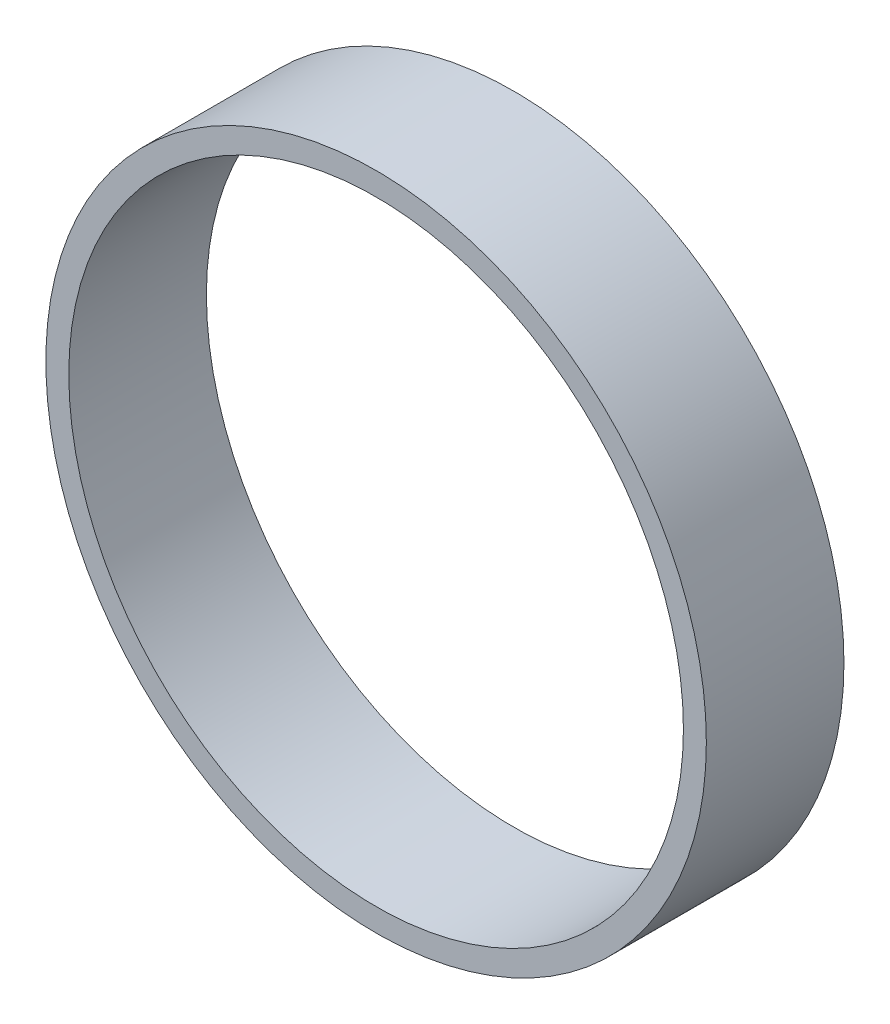
ISO-10303-21;
HEADER;
FILE_DESCRIPTION(('STEP AP214'),'2;1');
FILE_NAME('part.step','',(''),(''),'','','');
FILE_SCHEMA(('AUTOMOTIVE_DESIGN { 1 0 10303 214 1 1 1 1 }'));
ENDSEC;
DATA;
#1=APPLICATION_CONTEXT('core data for automotive mechanical design processes');
#2=APPLICATION_PROTOCOL_DEFINITION('international standard','automotive_design',2000,#1);
#3=PRODUCT_CONTEXT('',#1,'mechanical');
#4=PRODUCT('Part','Part','',(#3));
#5=PRODUCT_RELATED_PRODUCT_CATEGORY('part','',(#4));
#6=PRODUCT_DEFINITION_FORMATION('','',#4);
#7=PRODUCT_DEFINITION_CONTEXT('part definition',#1,'design');
#8=PRODUCT_DEFINITION('design','',#6,#7);
#9=PRODUCT_DEFINITION_SHAPE('','',#8);
#10=(LENGTH_UNIT() NAMED_UNIT(*) SI_UNIT(.MILLI.,.METRE.));
#11=(NAMED_UNIT(*) PLANE_ANGLE_UNIT() SI_UNIT($,.RADIAN.));
#12=(NAMED_UNIT(*) SI_UNIT($,.STERADIAN.) SOLID_ANGLE_UNIT());
#13=UNCERTAINTY_MEASURE_WITH_UNIT(LENGTH_MEASURE(1.E-05),#10,'distance_accuracy_value','');
#14=(GEOMETRIC_REPRESENTATION_CONTEXT(3) GLOBAL_UNCERTAINTY_ASSIGNED_CONTEXT((#13)) GLOBAL_UNIT_ASSIGNED_CONTEXT((#10,
#11,#12)) REPRESENTATION_CONTEXT('',''));
#15=CARTESIAN_POINT('',(0.,0.,0.));
#16=DIRECTION('',(0.,0.,1.));
#17=DIRECTION('',(1.,0.,0.));
#18=AXIS2_PLACEMENT_3D('',#15,#16,#17);
#19=CARTESIAN_POINT('',(0.,0.,30.));
#20=DIRECTION('',(0.,0.,1.));
#21=DIRECTION('',(1.,0.,0.));
#22=AXIS2_PLACEMENT_3D('',#19,#20,#21);
#23=PLANE('',#22);
#24=CARTESIAN_POINT('',(0.,0.,30.));
#25=DIRECTION('',(0.,0.,1.));
#26=DIRECTION('',(1.,0.,0.));
#27=AXIS2_PLACEMENT_3D('',#24,#25,#26);
#28=CIRCLE('',#27,72.);
#29=CARTESIAN_POINT('',(72.,0.,30.));
#30=VERTEX_POINT('',#29);
#31=EDGE_CURVE('E10',#30,#30,#28,.T.);
#32=ORIENTED_EDGE('',*,*,#31,.T.);
#33=EDGE_LOOP('',(#32));
#34=FACE_BOUND('',#33,.T.);
#35=CARTESIAN_POINT('',(0.,0.,30.));
#36=DIRECTION('',(0.,0.,1.));
#37=DIRECTION('',(1.,0.,0.));
#38=AXIS2_PLACEMENT_3D('',#35,#36,#37);
#39=CIRCLE('',#38,67.);
#40=CARTESIAN_POINT('',(67.,0.,30.));
#41=VERTEX_POINT('',#40);
#42=EDGE_CURVE('E52',#41,#41,#39,.T.);
#43=ORIENTED_EDGE('',*,*,#42,.F.);
#44=EDGE_LOOP('',(#43));
#45=FACE_BOUND('',#44,.T.);
#46=ADVANCED_FACE('F37',(#34,#45),#23,.T.);
#47=CARTESIAN_POINT('',(0.,0.,0.));
#48=DIRECTION('',(0.,0.,1.));
#49=DIRECTION('',(1.,0.,0.));
#50=AXIS2_PLACEMENT_3D('',#47,#48,#49);
#51=PLANE('',#50);
#52=CARTESIAN_POINT('',(0.,0.,0.));
#53=DIRECTION('',(0.,0.,1.));
#54=DIRECTION('',(1.,0.,0.));
#55=AXIS2_PLACEMENT_3D('',#52,#53,#54);
#56=CIRCLE('',#55,72.);
#57=CARTESIAN_POINT('',(72.,0.,0.));
#58=VERTEX_POINT('',#57);
#59=EDGE_CURVE('E41',#58,#58,#56,.T.);
#60=ORIENTED_EDGE('',*,*,#59,.F.);
#61=EDGE_LOOP('',(#60));
#62=FACE_BOUND('',#61,.T.);
#63=CARTESIAN_POINT('',(0.,0.,0.));
#64=DIRECTION('',(0.,0.,1.));
#65=DIRECTION('',(1.,0.,0.));
#66=AXIS2_PLACEMENT_3D('',#63,#64,#65);
#67=CIRCLE('',#66,67.);
#68=CARTESIAN_POINT('',(67.,0.,0.));
#69=VERTEX_POINT('',#68);
#70=EDGE_CURVE('E54',#69,#69,#67,.T.);
#71=ORIENTED_EDGE('',*,*,#70,.T.);
#72=EDGE_LOOP('',(#71));
#73=FACE_BOUND('',#72,.T.);
#74=ADVANCED_FACE('F64',(#62,#73),#51,.F.);
#75=CARTESIAN_POINT('',(0.,0.,30.));
#76=DIRECTION('',(0.,0.,-1.));
#77=DIRECTION('',(-1.,0.,0.));
#78=AXIS2_PLACEMENT_3D('',#75,#76,#77);
#79=CYLINDRICAL_SURFACE('',#78,72.);
#80=ORIENTED_EDGE('',*,*,#31,.F.);
#81=EDGE_LOOP('',(#80));
#82=FACE_BOUND('',#81,.T.);
#83=ORIENTED_EDGE('',*,*,#59,.T.);
#84=EDGE_LOOP('',(#83));
#85=FACE_BOUND('',#84,.T.);
#86=ADVANCED_FACE('F39',(#82,#85),#79,.T.);
#87=CARTESIAN_POINT('',(0.,0.,30.));
#88=DIRECTION('',(0.,0.,-1.));
#89=DIRECTION('',(-1.,0.,0.));
#90=AXIS2_PLACEMENT_3D('',#87,#88,#89);
#91=CYLINDRICAL_SURFACE('',#90,67.);
#92=ORIENTED_EDGE('',*,*,#42,.T.);
#93=EDGE_LOOP('',(#92));
#94=FACE_BOUND('',#93,.T.);
#95=ORIENTED_EDGE('',*,*,#70,.F.);
#96=EDGE_LOOP('',(#95));
#97=FACE_BOUND('',#96,.T.);
#98=ADVANCED_FACE('F60',(#94,#97),#91,.F.);
#99=CLOSED_SHELL('',(#46,#74,#86,#98));
#100=MANIFOLD_SOLID_BREP('B2',#99);
#101=ADVANCED_BREP_SHAPE_REPRESENTATION('',(#18,#100),#14);
#102=SHAPE_DEFINITION_REPRESENTATION(#9,#101);
ENDSEC;
END-ISO-10303-21;
